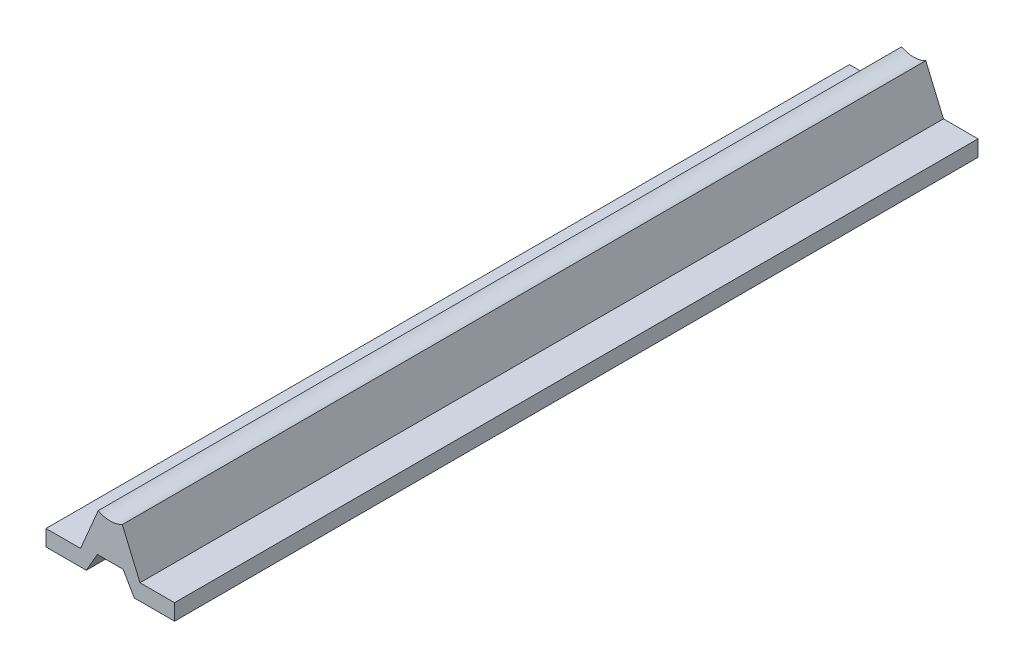
ISO-10303-21;
HEADER;
FILE_DESCRIPTION(('STEP AP214'),'2;1');
FILE_NAME('part.step','',(''),(''),'','','');
FILE_SCHEMA(('AUTOMOTIVE_DESIGN { 1 0 10303 214 1 1 1 1 }'));
ENDSEC;
DATA;
#1=APPLICATION_CONTEXT('core data for automotive mechanical design processes');
#2=APPLICATION_PROTOCOL_DEFINITION('international standard','automotive_design',2000,#1);
#3=PRODUCT_CONTEXT('',#1,'mechanical');
#4=PRODUCT('Part','Part','',(#3));
#5=PRODUCT_RELATED_PRODUCT_CATEGORY('part','',(#4));
#6=PRODUCT_DEFINITION_FORMATION('','',#4);
#7=PRODUCT_DEFINITION_CONTEXT('part definition',#1,'design');
#8=PRODUCT_DEFINITION('design','',#6,#7);
#9=PRODUCT_DEFINITION_SHAPE('','',#8);
#10=(LENGTH_UNIT() NAMED_UNIT(*) SI_UNIT(.MILLI.,.METRE.));
#11=(NAMED_UNIT(*) PLANE_ANGLE_UNIT() SI_UNIT($,.RADIAN.));
#12=(NAMED_UNIT(*) SI_UNIT($,.STERADIAN.) SOLID_ANGLE_UNIT());
#13=UNCERTAINTY_MEASURE_WITH_UNIT(LENGTH_MEASURE(1.E-05),#10,'distance_accuracy_value','');
#14=(GEOMETRIC_REPRESENTATION_CONTEXT(3) GLOBAL_UNCERTAINTY_ASSIGNED_CONTEXT((#13)) GLOBAL_UNIT_ASSIGNED_CONTEXT((#10,
#11,#12)) REPRESENTATION_CONTEXT('',''));
#15=CARTESIAN_POINT('',(0.,0.,0.));
#16=DIRECTION('',(0.,0.,1.));
#17=DIRECTION('',(1.,0.,0.));
#18=AXIS2_PLACEMENT_3D('',#15,#16,#17);
#19=CARTESIAN_POINT('',(-20.,-25.,250.));
#20=DIRECTION('',(1.,0.,0.));
#21=DIRECTION('',(0.,0.,-1.));
#22=AXIS2_PLACEMENT_3D('',#19,#20,#21);
#23=PLANE('',#22);
#24=DIRECTION('',(0.,-1.,0.));
#25=VECTOR('',#24,1.);
#26=CARTESIAN_POINT('',(-20.,-25.,0.));
#27=LINE('',#26,#25);
#28=CARTESIAN_POINT('',(-20.,-20.,0.));
#29=VERTEX_POINT('',#28);
#30=CARTESIAN_POINT('',(-20.,-25.,0.));
#31=VERTEX_POINT('',#30);
#32=EDGE_CURVE('E153',#29,#31,#27,.T.);
#33=ORIENTED_EDGE('',*,*,#32,.T.);
#34=DIRECTION('',(0.,0.,-1.));
#35=VECTOR('',#34,1.);
#36=CARTESIAN_POINT('',(-20.,-25.,250.));
#37=LINE('',#36,#35);
#38=CARTESIAN_POINT('',(-20.,-25.,250.));
#39=VERTEX_POINT('',#38);
#40=EDGE_CURVE('E11',#39,#31,#37,.T.);
#41=ORIENTED_EDGE('',*,*,#40,.F.);
#42=DIRECTION('',(0.,-1.,0.));
#43=VECTOR('',#42,1.);
#44=CARTESIAN_POINT('',(-20.,-25.,250.));
#45=LINE('',#44,#43);
#46=CARTESIAN_POINT('',(-20.,-20.,250.));
#47=VERTEX_POINT('',#46);
#48=EDGE_CURVE('E175',#47,#39,#45,.T.);
#49=ORIENTED_EDGE('',*,*,#48,.F.);
#50=DIRECTION('',(0.,0.,-1.));
#51=VECTOR('',#50,1.);
#52=CARTESIAN_POINT('',(-20.,-20.,250.));
#53=LINE('',#52,#51);
#54=EDGE_CURVE('E149',#47,#29,#53,.T.);
#55=ORIENTED_EDGE('',*,*,#54,.T.);
#56=EDGE_LOOP('',(#33,#41,#49,#55));
#57=FACE_BOUND('',#56,.T.);
#58=ADVANCED_FACE('F33',(#57),#23,.F.);
#59=CARTESIAN_POINT('',(-20.,-25.,250.));
#60=DIRECTION('',(0.,1.,0.));
#61=DIRECTION('',(0.,0.,1.));
#62=AXIS2_PLACEMENT_3D('',#59,#60,#61);
#63=PLANE('',#62);
#64=DIRECTION('',(1.,0.,0.));
#65=VECTOR('',#64,1.);
#66=CARTESIAN_POINT('',(-20.,-25.,0.));
#67=LINE('',#66,#65);
#68=CARTESIAN_POINT('',(-7.46410161513775,-25.,0.));
#69=VERTEX_POINT('',#68);
#70=EDGE_CURVE('E156',#31,#69,#67,.T.);
#71=ORIENTED_EDGE('',*,*,#70,.T.);
#72=DIRECTION('',(0.,0.,-1.));
#73=VECTOR('',#72,1.);
#74=CARTESIAN_POINT('',(-7.46410161513775,-25.,250.));
#75=LINE('',#74,#73);
#76=CARTESIAN_POINT('',(-7.46410161513775,-25.,250.));
#77=VERTEX_POINT('',#76);
#78=EDGE_CURVE('E41',#77,#69,#75,.T.);
#79=ORIENTED_EDGE('',*,*,#78,.F.);
#80=DIRECTION('',(1.,0.,0.));
#81=VECTOR('',#80,1.);
#82=CARTESIAN_POINT('',(-20.,-25.,250.));
#83=LINE('',#82,#81);
#84=EDGE_CURVE('E104',#39,#77,#83,.T.);
#85=ORIENTED_EDGE('',*,*,#84,.F.);
#86=ORIENTED_EDGE('',*,*,#40,.T.);
#87=EDGE_LOOP('',(#71,#79,#85,#86));
#88=FACE_BOUND('',#87,.T.);
#89=ADVANCED_FACE('F253',(#88),#63,.F.);
#90=CARTESIAN_POINT('',(-7.46410161513775,-25.,250.));
#91=DIRECTION('',(-0.866025403784439,0.5,0.));
#92=DIRECTION('',(-0.5,-0.866025403784439,0.));
#93=AXIS2_PLACEMENT_3D('',#90,#91,#92);
#94=PLANE('',#93);
#95=DIRECTION('',(0.5,0.866025403784439,0.));
#96=VECTOR('',#95,1.);
#97=CARTESIAN_POINT('',(-7.46410161513775,-25.,0.));
#98=LINE('',#97,#96);
#99=CARTESIAN_POINT('',(-4.,-19.,0.));
#100=VERTEX_POINT('',#99);
#101=EDGE_CURVE('E158',#69,#100,#98,.T.);
#102=ORIENTED_EDGE('',*,*,#101,.T.);
#103=DIRECTION('',(0.,0.,-1.));
#104=VECTOR('',#103,1.);
#105=CARTESIAN_POINT('',(-4.,-19.,250.));
#106=LINE('',#105,#104);
#107=CARTESIAN_POINT('',(-4.,-19.,250.));
#108=VERTEX_POINT('',#107);
#109=EDGE_CURVE('E194',#108,#100,#106,.T.);
#110=ORIENTED_EDGE('',*,*,#109,.F.);
#111=DIRECTION('',(0.5,0.866025403784439,0.));
#112=VECTOR('',#111,1.);
#113=CARTESIAN_POINT('',(-7.46410161513775,-25.,250.));
#114=LINE('',#113,#112);
#115=EDGE_CURVE('E202',#77,#108,#114,.T.);
#116=ORIENTED_EDGE('',*,*,#115,.F.);
#117=ORIENTED_EDGE('',*,*,#78,.T.);
#118=EDGE_LOOP('',(#102,#110,#116,#117));
#119=FACE_BOUND('',#118,.T.);
#120=ADVANCED_FACE('F200',(#119),#94,.F.);
#121=CARTESIAN_POINT('',(-4.,-19.,250.));
#122=DIRECTION('',(0.,1.,0.));
#123=DIRECTION('',(0.,0.,1.));
#124=AXIS2_PLACEMENT_3D('',#121,#122,#123);
#125=PLANE('',#124);
#126=DIRECTION('',(1.,0.,0.));
#127=VECTOR('',#126,1.);
#128=CARTESIAN_POINT('',(-4.,-19.,0.));
#129=LINE('',#128,#127);
#130=CARTESIAN_POINT('',(4.,-19.,0.));
#131=VERTEX_POINT('',#130);
#132=EDGE_CURVE('E160',#100,#131,#129,.T.);
#133=ORIENTED_EDGE('',*,*,#132,.T.);
#134=DIRECTION('',(0.,0.,-1.));
#135=VECTOR('',#134,1.);
#136=CARTESIAN_POINT('',(4.,-19.,250.));
#137=LINE('',#136,#135);
#138=CARTESIAN_POINT('',(4.,-19.,250.));
#139=VERTEX_POINT('',#138);
#140=EDGE_CURVE('E191',#139,#131,#137,.T.);
#141=ORIENTED_EDGE('',*,*,#140,.F.);
#142=DIRECTION('',(1.,0.,0.));
#143=VECTOR('',#142,1.);
#144=CARTESIAN_POINT('',(-4.,-19.,250.));
#145=LINE('',#144,#143);
#146=EDGE_CURVE('E220',#108,#139,#145,.T.);
#147=ORIENTED_EDGE('',*,*,#146,.F.);
#148=ORIENTED_EDGE('',*,*,#109,.T.);
#149=EDGE_LOOP('',(#133,#141,#147,#148));
#150=FACE_BOUND('',#149,.T.);
#151=ADVANCED_FACE('F211',(#150),#125,.F.);
#152=CARTESIAN_POINT('',(4.,-19.,250.));
#153=DIRECTION('',(0.866025403784439,0.499999999999999,0.));
#154=DIRECTION('',(-0.499999999999999,0.866025403784439,0.));
#155=AXIS2_PLACEMENT_3D('',#152,#153,#154);
#156=PLANE('',#155);
#157=DIRECTION('',(0.499999999999999,-0.866025403784439,0.));
#158=VECTOR('',#157,1.);
#159=CARTESIAN_POINT('',(4.,-19.,0.));
#160=LINE('',#159,#158);
#161=CARTESIAN_POINT('',(7.46410161513775,-25.,0.));
#162=VERTEX_POINT('',#161);
#163=EDGE_CURVE('E162',#131,#162,#160,.T.);
#164=ORIENTED_EDGE('',*,*,#163,.T.);
#165=DIRECTION('',(0.,0.,-1.));
#166=VECTOR('',#165,1.);
#167=CARTESIAN_POINT('',(7.46410161513775,-25.,250.));
#168=LINE('',#167,#166);
#169=CARTESIAN_POINT('',(7.46410161513775,-25.,250.));
#170=VERTEX_POINT('',#169);
#171=EDGE_CURVE('E188',#170,#162,#168,.T.);
#172=ORIENTED_EDGE('',*,*,#171,.F.);
#173=DIRECTION('',(0.499999999999999,-0.866025403784439,0.));
#174=VECTOR('',#173,1.);
#175=CARTESIAN_POINT('',(4.,-19.,250.));
#176=LINE('',#175,#174);
#177=EDGE_CURVE('E217',#139,#170,#176,.T.);
#178=ORIENTED_EDGE('',*,*,#177,.F.);
#179=ORIENTED_EDGE('',*,*,#140,.T.);
#180=EDGE_LOOP('',(#164,#172,#178,#179));
#181=FACE_BOUND('',#180,.T.);
#182=ADVANCED_FACE('F215',(#181),#156,.F.);
#183=CARTESIAN_POINT('',(7.46410161513775,-25.,250.));
#184=DIRECTION('',(0.,1.,0.));
#185=DIRECTION('',(-1.,0.,0.));
#186=AXIS2_PLACEMENT_3D('',#183,#184,#185);
#187=PLANE('',#186);
#188=DIRECTION('',(1.,0.,0.));
#189=VECTOR('',#188,1.);
#190=CARTESIAN_POINT('',(7.46410161513775,-25.,0.));
#191=LINE('',#190,#189);
#192=CARTESIAN_POINT('',(20.,-25.,0.));
#193=VERTEX_POINT('',#192);
#194=EDGE_CURVE('E164',#162,#193,#191,.T.);
#195=ORIENTED_EDGE('',*,*,#194,.T.);
#196=DIRECTION('',(0.,0.,-1.));
#197=VECTOR('',#196,1.);
#198=CARTESIAN_POINT('',(20.,-25.,250.));
#199=LINE('',#198,#197);
#200=CARTESIAN_POINT('',(20.,-25.,250.));
#201=VERTEX_POINT('',#200);
#202=EDGE_CURVE('E185',#201,#193,#199,.T.);
#203=ORIENTED_EDGE('',*,*,#202,.F.);
#204=DIRECTION('',(1.,0.,0.));
#205=VECTOR('',#204,1.);
#206=CARTESIAN_POINT('',(7.46410161513775,-25.,250.));
#207=LINE('',#206,#205);
#208=EDGE_CURVE('E219',#170,#201,#207,.T.);
#209=ORIENTED_EDGE('',*,*,#208,.F.);
#210=ORIENTED_EDGE('',*,*,#171,.T.);
#211=EDGE_LOOP('',(#195,#203,#209,#210));
#212=FACE_BOUND('',#211,.T.);
#213=ADVANCED_FACE('F266',(#212),#187,.F.);
#214=CARTESIAN_POINT('',(20.,-25.,250.));
#215=DIRECTION('',(-1.,0.,0.));
#216=DIRECTION('',(0.,0.,1.));
#217=AXIS2_PLACEMENT_3D('',#214,#215,#216);
#218=PLANE('',#217);
#219=DIRECTION('',(0.,1.,0.));
#220=VECTOR('',#219,1.);
#221=CARTESIAN_POINT('',(20.,-25.,0.));
#222=LINE('',#221,#220);
#223=CARTESIAN_POINT('',(20.,-20.,0.));
#224=VERTEX_POINT('',#223);
#225=EDGE_CURVE('E166',#193,#224,#222,.T.);
#226=ORIENTED_EDGE('',*,*,#225,.T.);
#227=DIRECTION('',(0.,0.,-1.));
#228=VECTOR('',#227,1.);
#229=CARTESIAN_POINT('',(20.,-20.,250.));
#230=LINE('',#229,#228);
#231=CARTESIAN_POINT('',(20.,-20.,250.));
#232=VERTEX_POINT('',#231);
#233=EDGE_CURVE('E182',#232,#224,#230,.T.);
#234=ORIENTED_EDGE('',*,*,#233,.F.);
#235=DIRECTION('',(0.,1.,0.));
#236=VECTOR('',#235,1.);
#237=CARTESIAN_POINT('',(20.,-25.,250.));
#238=LINE('',#237,#236);
#239=EDGE_CURVE('E222',#201,#232,#238,.T.);
#240=ORIENTED_EDGE('',*,*,#239,.F.);
#241=ORIENTED_EDGE('',*,*,#202,.T.);
#242=EDGE_LOOP('',(#226,#234,#240,#241));
#243=FACE_BOUND('',#242,.T.);
#244=ADVANCED_FACE('F269',(#243),#218,.F.);
#245=CARTESIAN_POINT('',(20.,-20.,250.));
#246=DIRECTION('',(0.,-1.,0.));
#247=DIRECTION('',(0.,0.,-1.));
#248=AXIS2_PLACEMENT_3D('',#245,#246,#247);
#249=PLANE('',#248);
#250=DIRECTION('',(-1.,0.,0.));
#251=VECTOR('',#250,1.);
#252=CARTESIAN_POINT('',(20.,-20.,0.));
#253=LINE('',#252,#251);
#254=CARTESIAN_POINT('',(9.25,-20.,0.));
#255=VERTEX_POINT('',#254);
#256=EDGE_CURVE('E168',#224,#255,#253,.T.);
#257=ORIENTED_EDGE('',*,*,#256,.T.);
#258=DIRECTION('',(0.,0.,-1.));
#259=VECTOR('',#258,1.);
#260=CARTESIAN_POINT('',(9.25,-20.,250.));
#261=LINE('',#260,#259);
#262=CARTESIAN_POINT('',(9.25,-20.,250.));
#263=VERTEX_POINT('',#262);
#264=EDGE_CURVE('E179',#263,#255,#261,.T.);
#265=ORIENTED_EDGE('',*,*,#264,.F.);
#266=DIRECTION('',(-1.,0.,0.));
#267=VECTOR('',#266,1.);
#268=CARTESIAN_POINT('',(20.,-20.,250.));
#269=LINE('',#268,#267);
#270=EDGE_CURVE('E228',#232,#263,#269,.T.);
#271=ORIENTED_EDGE('',*,*,#270,.F.);
#272=ORIENTED_EDGE('',*,*,#233,.T.);
#273=EDGE_LOOP('',(#257,#265,#271,#272));
#274=FACE_BOUND('',#273,.T.);
#275=ADVANCED_FACE('F234',(#274),#249,.F.);
#276=CARTESIAN_POINT('',(3.75,-7.06664701255129,250.));
#277=DIRECTION('',(-0.920245732120231,-0.391341018185547,0.));
#278=DIRECTION('',(0.391341018185547,-0.920245732120231,0.));
#279=AXIS2_PLACEMENT_3D('',#276,#277,#278);
#280=PLANE('',#279);
#281=DIRECTION('',(-0.391341018185547,0.920245732120231,0.));
#282=VECTOR('',#281,1.);
#283=CARTESIAN_POINT('',(3.75,-7.06664701255129,0.));
#284=LINE('',#283,#282);
#285=CARTESIAN_POINT('',(3.75,-7.06664701255129,0.));
#286=VERTEX_POINT('',#285);
#287=EDGE_CURVE('E170',#255,#286,#284,.T.);
#288=ORIENTED_EDGE('',*,*,#287,.T.);
#289=DIRECTION('',(0.,0.,-1.));
#290=VECTOR('',#289,1.);
#291=CARTESIAN_POINT('',(3.75,-7.06664701255129,250.));
#292=LINE('',#291,#290);
#293=CARTESIAN_POINT('',(3.75,-7.06664701255129,250.));
#294=VERTEX_POINT('',#293);
#295=EDGE_CURVE('E144',#294,#286,#292,.T.);
#296=ORIENTED_EDGE('',*,*,#295,.F.);
#297=DIRECTION('',(-0.391341018185547,0.920245732120231,0.));
#298=VECTOR('',#297,1.);
#299=CARTESIAN_POINT('',(3.75,-7.06664701255129,250.));
#300=LINE('',#299,#298);
#301=EDGE_CURVE('E135',#263,#294,#300,.T.);
#302=ORIENTED_EDGE('',*,*,#301,.F.);
#303=ORIENTED_EDGE('',*,*,#264,.T.);
#304=EDGE_LOOP('',(#288,#296,#302,#303));
#305=FACE_BOUND('',#304,.T.);
#306=ADVANCED_FACE('F238',(#305),#280,.F.);
#307=CARTESIAN_POINT('',(0.,0.,250.));
#308=DIRECTION('',(0.,0.,-1.));
#309=DIRECTION('',(-1.,0.,0.));
#310=AXIS2_PLACEMENT_3D('',#307,#308,#309);
#311=CYLINDRICAL_SURFACE('',#310,8.);
#312=CARTESIAN_POINT('',(0.,0.,0.));
#313=DIRECTION('',(0.,0.,-1.));
#314=DIRECTION('',(1.,0.,0.));
#315=AXIS2_PLACEMENT_3D('',#312,#313,#314);
#316=CIRCLE('',#315,8.);
#317=CARTESIAN_POINT('',(-3.75000000000001,-7.06664701255128,0.));
#318=VERTEX_POINT('',#317);
#319=EDGE_CURVE('E143',#286,#318,#316,.T.);
#320=ORIENTED_EDGE('',*,*,#319,.T.);
#321=DIRECTION('',(0.,0.,-1.));
#322=VECTOR('',#321,1.);
#323=CARTESIAN_POINT('',(-3.75000000000001,-7.06664701255128,250.));
#324=LINE('',#323,#322);
#325=CARTESIAN_POINT('',(-3.75000000000001,-7.06664701255128,250.));
#326=VERTEX_POINT('',#325);
#327=EDGE_CURVE('E140',#326,#318,#324,.T.);
#328=ORIENTED_EDGE('',*,*,#327,.F.);
#329=CARTESIAN_POINT('',(0.,0.,250.));
#330=DIRECTION('',(0.,0.,-1.));
#331=DIRECTION('',(1.,0.,0.));
#332=AXIS2_PLACEMENT_3D('',#329,#330,#331);
#333=CIRCLE('',#332,8.);
#334=EDGE_CURVE('E129',#294,#326,#333,.T.);
#335=ORIENTED_EDGE('',*,*,#334,.F.);
#336=ORIENTED_EDGE('',*,*,#295,.T.);
#337=EDGE_LOOP('',(#320,#328,#335,#336));
#338=FACE_BOUND('',#337,.T.);
#339=ADVANCED_FACE('F141',(#338),#311,.F.);
#340=CARTESIAN_POINT('',(-9.25,-20.,250.));
#341=DIRECTION('',(0.920245732120231,-0.391341018185547,0.));
#342=DIRECTION('',(0.391341018185547,0.920245732120231,0.));
#343=AXIS2_PLACEMENT_3D('',#340,#341,#342);
#344=PLANE('',#343);
#345=DIRECTION('',(-0.391341018185547,-0.920245732120231,0.));
#346=VECTOR('',#345,1.);
#347=CARTESIAN_POINT('',(-9.25,-20.,0.));
#348=LINE('',#347,#346);
#349=CARTESIAN_POINT('',(-9.25,-20.,0.));
#350=VERTEX_POINT('',#349);
#351=EDGE_CURVE('E90',#318,#350,#348,.T.);
#352=ORIENTED_EDGE('',*,*,#351,.T.);
#353=DIRECTION('',(0.,0.,-1.));
#354=VECTOR('',#353,1.);
#355=CARTESIAN_POINT('',(-9.25,-20.,250.));
#356=LINE('',#355,#354);
#357=CARTESIAN_POINT('',(-9.25,-20.,250.));
#358=VERTEX_POINT('',#357);
#359=EDGE_CURVE('E145',#358,#350,#356,.T.);
#360=ORIENTED_EDGE('',*,*,#359,.F.);
#361=DIRECTION('',(-0.391341018185547,-0.920245732120231,0.));
#362=VECTOR('',#361,1.);
#363=CARTESIAN_POINT('',(-9.25,-20.,250.));
#364=LINE('',#363,#362);
#365=EDGE_CURVE('E133',#326,#358,#364,.T.);
#366=ORIENTED_EDGE('',*,*,#365,.F.);
#367=ORIENTED_EDGE('',*,*,#327,.T.);
#368=EDGE_LOOP('',(#352,#360,#366,#367));
#369=FACE_BOUND('',#368,.T.);
#370=ADVANCED_FACE('F147',(#369),#344,.F.);
#371=CARTESIAN_POINT('',(-20.,-20.,250.));
#372=DIRECTION('',(0.,-1.,0.));
#373=DIRECTION('',(1.,0.,0.));
#374=AXIS2_PLACEMENT_3D('',#371,#372,#373);
#375=PLANE('',#374);
#376=DIRECTION('',(-1.,0.,0.));
#377=VECTOR('',#376,1.);
#378=CARTESIAN_POINT('',(-20.,-20.,0.));
#379=LINE('',#378,#377);
#380=EDGE_CURVE('E96',#350,#29,#379,.T.);
#381=ORIENTED_EDGE('',*,*,#380,.T.);
#382=ORIENTED_EDGE('',*,*,#54,.F.);
#383=DIRECTION('',(-1.,0.,0.));
#384=VECTOR('',#383,1.);
#385=CARTESIAN_POINT('',(-20.,-20.,250.));
#386=LINE('',#385,#384);
#387=EDGE_CURVE('E49',#358,#47,#386,.T.);
#388=ORIENTED_EDGE('',*,*,#387,.F.);
#389=ORIENTED_EDGE('',*,*,#359,.T.);
#390=EDGE_LOOP('',(#381,#382,#388,#389));
#391=FACE_BOUND('',#390,.T.);
#392=ADVANCED_FACE('F242',(#391),#375,.F.);
#393=CARTESIAN_POINT('',(0.,0.,250.));
#394=DIRECTION('',(0.,0.,1.));
#395=DIRECTION('',(1.,0.,0.));
#396=AXIS2_PLACEMENT_3D('',#393,#394,#395);
#397=PLANE('',#396);
#398=ORIENTED_EDGE('',*,*,#48,.T.);
#399=ORIENTED_EDGE('',*,*,#84,.T.);
#400=ORIENTED_EDGE('',*,*,#115,.T.);
#401=ORIENTED_EDGE('',*,*,#146,.T.);
#402=ORIENTED_EDGE('',*,*,#177,.T.);
#403=ORIENTED_EDGE('',*,*,#208,.T.);
#404=ORIENTED_EDGE('',*,*,#239,.T.);
#405=ORIENTED_EDGE('',*,*,#270,.T.);
#406=ORIENTED_EDGE('',*,*,#301,.T.);
#407=ORIENTED_EDGE('',*,*,#334,.T.);
#408=ORIENTED_EDGE('',*,*,#365,.T.);
#409=ORIENTED_EDGE('',*,*,#387,.T.);
#410=EDGE_LOOP('',(#398,#399,#400,#401,#402,#403,#404,#405,#406,#407,#408,#409));
#411=FACE_BOUND('',#410,.T.);
#412=ADVANCED_FACE('F131',(#411),#397,.T.);
#413=CARTESIAN_POINT('',(0.,0.,0.));
#414=DIRECTION('',(0.,0.,1.));
#415=DIRECTION('',(1.,0.,0.));
#416=AXIS2_PLACEMENT_3D('',#413,#414,#415);
#417=PLANE('',#416);
#418=ORIENTED_EDGE('',*,*,#32,.F.);
#419=ORIENTED_EDGE('',*,*,#380,.F.);
#420=ORIENTED_EDGE('',*,*,#351,.F.);
#421=ORIENTED_EDGE('',*,*,#319,.F.);
#422=ORIENTED_EDGE('',*,*,#287,.F.);
#423=ORIENTED_EDGE('',*,*,#256,.F.);
#424=ORIENTED_EDGE('',*,*,#225,.F.);
#425=ORIENTED_EDGE('',*,*,#194,.F.);
#426=ORIENTED_EDGE('',*,*,#163,.F.);
#427=ORIENTED_EDGE('',*,*,#132,.F.);
#428=ORIENTED_EDGE('',*,*,#101,.F.);
#429=ORIENTED_EDGE('',*,*,#70,.F.);
#430=EDGE_LOOP('',(#418,#419,#420,#421,#422,#423,#424,#425,#426,#427,#428,#429));
#431=FACE_BOUND('',#430,.T.);
#432=ADVANCED_FACE('F206',(#431),#417,.F.);
#433=CLOSED_SHELL('',(#58,#89,#120,#151,#182,#213,#244,#275,#306,#339,#370,#392,#412,#432));
#434=MANIFOLD_SOLID_BREP('B2',#433);
#435=ADVANCED_BREP_SHAPE_REPRESENTATION('',(#18,#434),#14);
#436=SHAPE_DEFINITION_REPRESENTATION(#9,#435);
ENDSEC;
END-ISO-10303-21;
